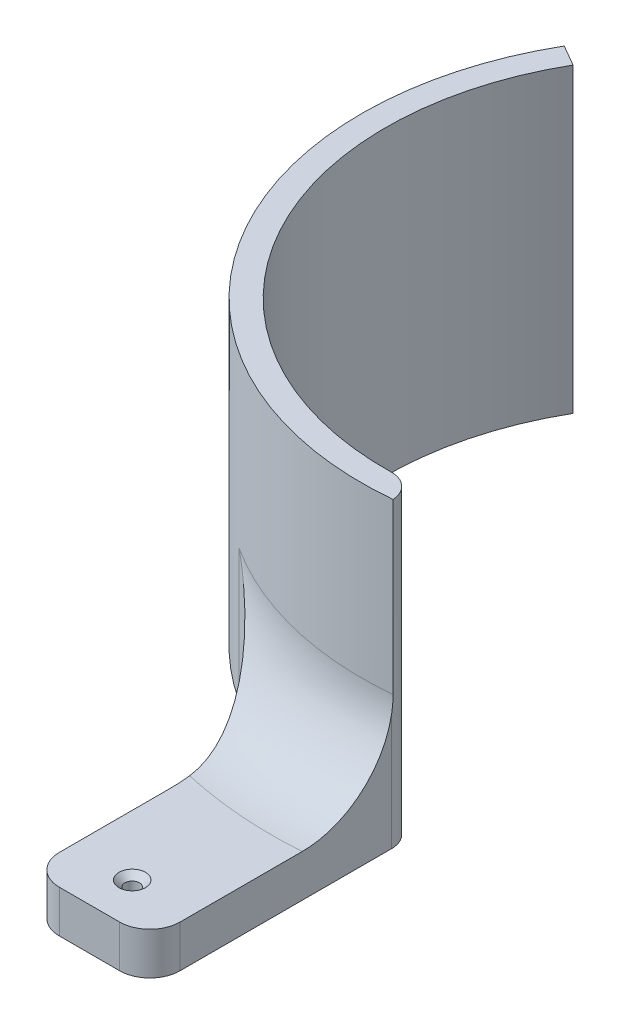
ISO-10303-21;
HEADER;
FILE_DESCRIPTION(('STEP AP214'),'2;1');
FILE_NAME('part.step','',(''),(''),'','','');
FILE_SCHEMA(('AUTOMOTIVE_DESIGN { 1 0 10303 214 1 1 1 1 }'));
ENDSEC;
DATA;
#1=APPLICATION_CONTEXT('core data for automotive mechanical design processes');
#2=APPLICATION_PROTOCOL_DEFINITION('international standard','automotive_design',2000,#1);
#3=PRODUCT_CONTEXT('',#1,'mechanical');
#4=PRODUCT('Part','Part','',(#3));
#5=PRODUCT_RELATED_PRODUCT_CATEGORY('part','',(#4));
#6=PRODUCT_DEFINITION_FORMATION('','',#4);
#7=PRODUCT_DEFINITION_CONTEXT('part definition',#1,'design');
#8=PRODUCT_DEFINITION('design','',#6,#7);
#9=PRODUCT_DEFINITION_SHAPE('','',#8);
#10=(LENGTH_UNIT() NAMED_UNIT(*) SI_UNIT(.MILLI.,.METRE.));
#11=(NAMED_UNIT(*) PLANE_ANGLE_UNIT() SI_UNIT($,.RADIAN.));
#12=(NAMED_UNIT(*) SI_UNIT($,.STERADIAN.) SOLID_ANGLE_UNIT());
#13=UNCERTAINTY_MEASURE_WITH_UNIT(LENGTH_MEASURE(1.E-05),#10,'distance_accuracy_value','');
#14=(GEOMETRIC_REPRESENTATION_CONTEXT(3) GLOBAL_UNCERTAINTY_ASSIGNED_CONTEXT((#13)) GLOBAL_UNIT_ASSIGNED_CONTEXT((#10,
#11,#12)) REPRESENTATION_CONTEXT('',''));
#15=CARTESIAN_POINT('',(0.,0.,0.));
#16=DIRECTION('',(0.,0.,1.));
#17=DIRECTION('',(1.,0.,0.));
#18=AXIS2_PLACEMENT_3D('',#15,#16,#17);
#19=CARTESIAN_POINT('',(-5.,7.,86.));
#20=DIRECTION('',(0.,1.,0.));
#21=DIRECTION('',(0.,0.,1.));
#22=AXIS2_PLACEMENT_3D('',#19,#20,#21);
#23=CYLINDRICAL_SURFACE('',#22,1.19999999999999);
#24=CARTESIAN_POINT('',(-5.,6.,86.));
#25=DIRECTION('',(0.,1.,0.));
#26=DIRECTION('',(0.,0.,1.));
#27=AXIS2_PLACEMENT_3D('',#24,#25,#26);
#28=CIRCLE('',#27,1.2);
#29=CARTESIAN_POINT('',(-5.,6.,87.2));
#30=VERTEX_POINT('',#29);
#31=EDGE_CURVE('E163',#30,#30,#28,.T.);
#32=ORIENTED_EDGE('',*,*,#31,.T.);
#33=EDGE_LOOP('',(#32));
#34=FACE_BOUND('',#33,.T.);
#35=CARTESIAN_POINT('',(-5.,3.,86.));
#36=DIRECTION('',(0.,-1.,0.));
#37=DIRECTION('',(0.,0.,-1.));
#38=AXIS2_PLACEMENT_3D('',#35,#36,#37);
#39=CIRCLE('',#38,1.19999999999999);
#40=CARTESIAN_POINT('',(-5.,3.,84.8));
#41=VERTEX_POINT('',#40);
#42=EDGE_CURVE('E44',#41,#41,#39,.F.);
#43=ORIENTED_EDGE('',*,*,#42,.F.);
#44=EDGE_LOOP('',(#43));
#45=FACE_BOUND('',#44,.T.);
#46=ADVANCED_FACE('F39',(#34,#45),#23,.F.);
#47=CARTESIAN_POINT('',(0.,50.,0.));
#48=DIRECTION('',(0.,-1.,0.));
#49=DIRECTION('',(0.,0.,-1.));
#50=AXIS2_PLACEMENT_3D('',#47,#48,#49);
#51=CYLINDRICAL_SURFACE('',#50,53.);
#52=CARTESIAN_POINT('',(0.,22.,0.));
#53=DIRECTION('',(0.,1.,0.));
#54=DIRECTION('',(0.,0.,1.));
#55=AXIS2_PLACEMENT_3D('',#52,#53,#54);
#56=CIRCLE('',#55,53.);
#57=CARTESIAN_POINT('',(-28.7349397590362,22.,44.5342928207529));
#58=VERTEX_POINT('',#57);
#59=CARTESIAN_POINT('',(4.9935914548164,22.,52.7642307286137));
#60=VERTEX_POINT('',#59);
#61=EDGE_CURVE('E213',#58,#60,#56,.T.);
#62=ORIENTED_EDGE('',*,*,#61,.T.);
#63=DIRECTION('',(0.,-1.,0.));
#64=VECTOR('',#63,1.);
#65=CARTESIAN_POINT('',(4.9935914548164,22.,52.7642307286137));
#66=LINE('',#65,#64);
#67=CARTESIAN_POINT('',(4.99359145481642,50.,52.7642307286137));
#68=VERTEX_POINT('',#67);
#69=EDGE_CURVE('E49',#60,#68,#66,.F.);
#70=ORIENTED_EDGE('',*,*,#69,.T.);
#71=CARTESIAN_POINT('',(0.,50.,0.));
#72=DIRECTION('',(0.,1.,0.));
#73=DIRECTION('',(0.,0.,1.));
#74=AXIS2_PLACEMENT_3D('',#71,#72,#73);
#75=CIRCLE('',#74,53.);
#76=CARTESIAN_POINT('',(-45.8993464005753,50.,-26.4999999999999));
#77=VERTEX_POINT('',#76);
#78=EDGE_CURVE('E188',#77,#68,#75,.T.);
#79=ORIENTED_EDGE('',*,*,#78,.F.);
#80=DIRECTION('',(0.,-1.,0.));
#81=VECTOR('',#80,1.);
#82=CARTESIAN_POINT('',(-45.8993464005753,50.,-26.4999999999999));
#83=LINE('',#82,#81);
#84=CARTESIAN_POINT('',(-45.8993464005753,0.,-26.4999999999999));
#85=VERTEX_POINT('',#84);
#86=EDGE_CURVE('E190',#77,#85,#83,.T.);
#87=ORIENTED_EDGE('',*,*,#86,.T.);
#88=CARTESIAN_POINT('',(0.,0.,0.));
#89=DIRECTION('',(0.,1.,0.));
#90=DIRECTION('',(0.,0.,1.));
#91=AXIS2_PLACEMENT_3D('',#88,#89,#90);
#92=CIRCLE('',#91,53.);
#93=CARTESIAN_POINT('',(-28.7349397590362,0.,44.5342928207529));
#94=VERTEX_POINT('',#93);
#95=EDGE_CURVE('E185',#85,#94,#92,.T.);
#96=ORIENTED_EDGE('',*,*,#95,.T.);
#97=DIRECTION('',(0.,-1.,0.));
#98=VECTOR('',#97,1.);
#99=CARTESIAN_POINT('',(-28.7349397590362,50.,44.5342928207529));
#100=LINE('',#99,#98);
#101=EDGE_CURVE('E207',#94,#58,#100,.F.);
#102=ORIENTED_EDGE('',*,*,#101,.T.);
#103=EDGE_LOOP('',(#62,#70,#79,#87,#96,#102));
#104=FACE_BOUND('',#103,.T.);
#105=ADVANCED_FACE('F263',(#104),#51,.T.);
#106=CARTESIAN_POINT('',(5.00000000000001,50.,52.7636238330917));
#107=DIRECTION('',(-1.,0.,0.));
#108=DIRECTION('',(0.,0.,1.));
#109=AXIS2_PLACEMENT_3D('',#106,#107,#108);
#110=PLANE('',#109);
#111=DIRECTION('',(0.,0.,-1.));
#112=VECTOR('',#111,1.);
#113=CARTESIAN_POINT('',(5.00000000000001,0.,52.7636238330917));
#114=LINE('',#113,#112);
#115=CARTESIAN_POINT('',(5.00000000000001,0.,88.074872));
#116=VERTEX_POINT('',#115);
#117=CARTESIAN_POINT('',(5.00000000000001,0.,52.9905651979671));
#118=VERTEX_POINT('',#117);
#119=EDGE_CURVE('E142',#116,#118,#114,.T.);
#120=ORIENTED_EDGE('',*,*,#119,.T.);
#121=DIRECTION('',(0.,1.,0.));
#122=VECTOR('',#121,1.);
#123=CARTESIAN_POINT('',(5.00000000000001,50.,52.9905651979671));
#124=LINE('',#123,#122);
#125=CARTESIAN_POINT('',(5.00000000000001,19.406361647961,52.9905651979671));
#126=VERTEX_POINT('',#125);
#127=EDGE_CURVE('E248',#118,#126,#124,.T.);
#128=ORIENTED_EDGE('',*,*,#127,.T.);
#129=CARTESIAN_POINT('',(4.99999999999999,22.,52.7636238330917));
#130=CARTESIAN_POINT('',(5.,21.7896684227948,52.7636239609811));
#131=CARTESIAN_POINT('',(5.00000000000001,21.5793625139187,52.7680682974797));
#132=CARTESIAN_POINT('',(5.00000000000001,21.1591266730219,52.7858334416211));
#133=CARTESIAN_POINT('',(5.00000000000001,20.9491967397204,52.7991542189711));
#134=CARTESIAN_POINT('',(5.00000000000001,20.3205732648709,52.852403380692));
#135=CARTESIAN_POINT('',(5.00000000000001,19.9029277045977,52.9056186095851));
#136=CARTESIAN_POINT('',(5.00000000000001,19.0740429292269,53.0470216896745));
#137=CARTESIAN_POINT('',(5.00000000000001,18.6627982923356,53.1351780572822));
#138=CARTESIAN_POINT('',(5.00000000000001,17.8491863055232,53.34581854223));
#139=CARTESIAN_POINT('',(5.00000000000001,17.4468188669925,53.4683023167567));
#140=CARTESIAN_POINT('',(5.00000000000001,16.6536564053013,53.746761055701));
#141=CARTESIAN_POINT('',(5.00000000000001,16.2628663984324,53.9027503027468));
#142=CARTESIAN_POINT('',(5.00000000000001,15.495793755682,54.2470529497319));
#143=CARTESIAN_POINT('',(5.00000000000001,15.1195111644183,54.4353664490754));
#144=CARTESIAN_POINT('',(5.00000000000001,14.3841551097749,54.8429242051387));
#145=CARTESIAN_POINT('',(5.00000000000001,14.0250793303336,55.0621642833407));
#146=CARTESIAN_POINT('',(5.00000000000001,13.3266019633218,55.5300124804355));
#147=CARTESIAN_POINT('',(5.00000000000001,12.9872003109244,55.7786205025516));
#148=CARTESIAN_POINT('',(5.00000000000001,12.3297017616124,56.304013726387));
#149=CARTESIAN_POINT('',(5.00000000000001,12.0116545385873,56.5808610918471));
#150=CARTESIAN_POINT('',(5.00000000000001,11.3999276148495,57.1602839018418));
#151=CARTESIAN_POINT('',(5.00000000000001,11.1062480681791,57.4628595089952));
#152=CARTESIAN_POINT('',(5.00000000000001,10.5452493682504,58.0916451477704));
#153=CARTESIAN_POINT('',(5.00000000000001,10.2779356678764,58.4178600442815));
#154=CARTESIAN_POINT('',(5.00000000000001,9.77160275295379,59.0915471238797));
#155=CARTESIAN_POINT('',(5.00000000000001,9.53258318834467,59.4390190438899));
#156=CARTESIAN_POINT('',(5.00000000000001,9.08357443771194,60.1542367758666));
#157=CARTESIAN_POINT('',(5.00000000000001,8.87370868736317,60.5220600907922));
#158=CARTESIAN_POINT('',(5.00000000000001,8.48564643372473,61.2740491317857));
#159=CARTESIAN_POINT('',(5.00000000000001,8.30745027877539,61.6582150375515));
#160=CARTESIAN_POINT('',(5.00000000000001,7.98404945903902,62.4400079381927));
#161=CARTESIAN_POINT('',(5.00000000000001,7.83883018092782,62.8376288805144));
#162=CARTESIAN_POINT('',(5.00000000000001,7.58233784783105,63.6435074140847));
#163=CARTESIAN_POINT('',(5.00000000000001,7.47105688558824,64.0517625035962));
#164=CARTESIAN_POINT('',(5.00000000000001,7.25187313943226,65.0136926112583));
#165=CARTESIAN_POINT('',(5.00000000000001,7.15743190283525,65.5705267233045));
#166=CARTESIAN_POINT('',(5.00000000000001,7.06299294305981,66.4103367517457));
#167=CARTESIAN_POINT('',(5.00000000000001,7.03938380011824,66.6908760970503));
#168=CARTESIAN_POINT('',(5.00000000000001,7.00788719003877,67.252895439764));
#169=CARTESIAN_POINT('',(5.00000000000001,7.00000304126956,67.5343756231631));
#170=CARTESIAN_POINT('',(5.00000000000001,7.,67.8159273327439));
#171=B_SPLINE_CURVE_WITH_KNOTS('',3,(#129,#130,#131,#132,#133,#134,#135,#136,#137,#138,#139,
#140,#141,#142,#143,#144,#145,#146,#147,#148,#149,#150,#151,#152,#153,#154,#155,#156,#157,#158,
#159,#160,#161,#162,#163,#164,#165,#166,#167,#168,#169,#170),.UNSPECIFIED.,.F.,.F.,(4,2,2,2,2,2,
2,2,2,2,2,2,2,2,2,2,2,2,2,2,4),(0.,0.630896541018762,1.26179092896793,2.52322581844804,
3.78352667103805,5.04381493798084,6.30464150740511,7.56547195422071,8.82613221198046,
10.0867883155825,11.3502819979744,12.6137836670423,13.8775461031959,15.1412929021979,
16.4102370958587,17.6791952460319,18.9475899698433,20.2156889453624,21.9060121719131,
22.7502361460259,23.5946382537582),.UNSPECIFIED.);
#172=CARTESIAN_POINT('',(5.00000000000001,7.,67.8159273327439));
#173=VERTEX_POINT('',#172);
#174=EDGE_CURVE('E217',#126,#173,#171,.T.);
#175=ORIENTED_EDGE('',*,*,#174,.T.);
#176=DIRECTION('',(0.,0.,-1.));
#177=VECTOR('',#176,1.);
#178=CARTESIAN_POINT('',(5.00000000000001,7.,0.));
#179=LINE('',#178,#177);
#180=CARTESIAN_POINT('',(5.00000000000001,7.,88.074872));
#181=VERTEX_POINT('',#180);
#182=EDGE_CURVE('E167',#181,#173,#179,.T.);
#183=ORIENTED_EDGE('',*,*,#182,.F.);
#184=DIRECTION('',(0.,-1.,0.));
#185=VECTOR('',#184,1.);
#186=CARTESIAN_POINT('',(5.00000000000001,7.,88.074872));
#187=LINE('',#186,#185);
#188=EDGE_CURVE('E177',#181,#116,#187,.T.);
#189=ORIENTED_EDGE('',*,*,#188,.T.);
#190=EDGE_LOOP('',(#120,#128,#175,#183,#189));
#191=FACE_BOUND('',#190,.T.);
#192=ADVANCED_FACE('F231',(#191),#110,.F.);
#193=CARTESIAN_POINT('',(0.,50.,0.));
#194=DIRECTION('',(0.,-1.,0.));
#195=DIRECTION('',(0.,0.,-1.));
#196=AXIS2_PLACEMENT_3D('',#193,#194,#195);
#197=CYLINDRICAL_SURFACE('',#196,49.);
#198=CARTESIAN_POINT('',(0.,50.,0.));
#199=DIRECTION('',(0.,1.,0.));
#200=DIRECTION('',(0.,0.,1.));
#201=AXIS2_PLACEMENT_3D('',#198,#199,#200);
#202=CIRCLE('',#201,49.);
#203=CARTESIAN_POINT('',(-42.4352447854376,50.,-24.4999999999999));
#204=VERTEX_POINT('',#203);
#205=CARTESIAN_POINT('',(0.9245283018868,50.,48.9912772584979));
#206=VERTEX_POINT('',#205);
#207=EDGE_CURVE('E181',#204,#206,#202,.T.);
#208=ORIENTED_EDGE('',*,*,#207,.T.);
#209=DIRECTION('',(0.,-1.,0.));
#210=VECTOR('',#209,1.);
#211=CARTESIAN_POINT('',(0.9245283018868,50.,48.9912772584979));
#212=LINE('',#211,#210);
#213=CARTESIAN_POINT('',(0.9245283018868,0.,48.9912772584979));
#214=VERTEX_POINT('',#213);
#215=EDGE_CURVE('E251',#206,#214,#212,.T.);
#216=ORIENTED_EDGE('',*,*,#215,.T.);
#217=CARTESIAN_POINT('',(0.,0.,0.));
#218=DIRECTION('',(0.,1.,0.));
#219=DIRECTION('',(0.,0.,1.));
#220=AXIS2_PLACEMENT_3D('',#217,#218,#219);
#221=CIRCLE('',#220,49.);
#222=CARTESIAN_POINT('',(-42.4352447854376,0.,-24.4999999999999));
#223=VERTEX_POINT('',#222);
#224=EDGE_CURVE('E193',#223,#214,#221,.T.);
#225=ORIENTED_EDGE('',*,*,#224,.F.);
#226=DIRECTION('',(0.,-1.,0.));
#227=VECTOR('',#226,1.);
#228=CARTESIAN_POINT('',(-42.4352447854376,50.,-24.4999999999999));
#229=LINE('',#228,#227);
#230=EDGE_CURVE('E202',#204,#223,#229,.T.);
#231=ORIENTED_EDGE('',*,*,#230,.F.);
#232=EDGE_LOOP('',(#208,#216,#225,#231));
#233=FACE_BOUND('',#232,.T.);
#234=ADVANCED_FACE('F271',(#233),#197,.F.);
#235=CARTESIAN_POINT('',(-45.8993464005753,50.,-26.4999999999999));
#236=DIRECTION('',(0.499999999999997,0.,-0.866025403784441));
#237=DIRECTION('',(-0.866025403784441,0.,-0.499999999999997));
#238=AXIS2_PLACEMENT_3D('',#235,#236,#237);
#239=PLANE('',#238);
#240=DIRECTION('',(0.866025403784441,0.,0.499999999999997));
#241=VECTOR('',#240,1.);
#242=CARTESIAN_POINT('',(-45.8993464005753,0.,-26.4999999999999));
#243=LINE('',#242,#241);
#244=EDGE_CURVE('E196',#85,#223,#243,.T.);
#245=ORIENTED_EDGE('',*,*,#244,.F.);
#246=ORIENTED_EDGE('',*,*,#86,.F.);
#247=DIRECTION('',(0.866025403784441,0.,0.499999999999997));
#248=VECTOR('',#247,1.);
#249=CARTESIAN_POINT('',(-45.8993464005753,50.,-26.4999999999999));
#250=LINE('',#249,#248);
#251=EDGE_CURVE('E184',#77,#204,#250,.T.);
#252=ORIENTED_EDGE('',*,*,#251,.T.);
#253=ORIENTED_EDGE('',*,*,#230,.T.);
#254=EDGE_LOOP('',(#245,#246,#252,#253));
#255=FACE_BOUND('',#254,.T.);
#256=ADVANCED_FACE('F274',(#255),#239,.T.);
#257=CARTESIAN_POINT('',(0.,50.,0.));
#258=DIRECTION('',(0.,1.,0.));
#259=DIRECTION('',(0.,0.,1.));
#260=AXIS2_PLACEMENT_3D('',#257,#258,#259);
#261=PLANE('',#260);
#262=ORIENTED_EDGE('',*,*,#78,.T.);
#263=CARTESIAN_POINT('',(1.00000000000001,50.,52.9905651979671));
#264=DIRECTION('',(0.,1.,0.));
#265=DIRECTION('',(0.,0.,1.));
#266=AXIS2_PLACEMENT_3D('',#263,#264,#265);
#267=CIRCLE('',#266,4.);
#268=EDGE_CURVE('E11',#68,#206,#267,.T.);
#269=ORIENTED_EDGE('',*,*,#268,.T.);
#270=ORIENTED_EDGE('',*,*,#207,.F.);
#271=ORIENTED_EDGE('',*,*,#251,.F.);
#272=EDGE_LOOP('',(#262,#269,#270,#271));
#273=FACE_BOUND('',#272,.T.);
#274=ADVANCED_FACE('F269',(#273),#261,.T.);
#275=CARTESIAN_POINT('',(0.,0.,0.));
#276=DIRECTION('',(0.,1.,0.));
#277=DIRECTION('',(0.,0.,1.));
#278=AXIS2_PLACEMENT_3D('',#275,#276,#277);
#279=PLANE('',#278);
#280=CARTESIAN_POINT('',(-5.,0.,86.));
#281=DIRECTION('',(0.,-1.,0.));
#282=DIRECTION('',(0.,0.,-1.));
#283=AXIS2_PLACEMENT_3D('',#280,#281,#282);
#284=CIRCLE('',#283,2.9);
#285=CARTESIAN_POINT('',(-5.,0.,83.1));
#286=VERTEX_POINT('',#285);
#287=EDGE_CURVE('E483',#286,#286,#284,.T.);
#288=ORIENTED_EDGE('',*,*,#287,.F.);
#289=EDGE_LOOP('',(#288));
#290=FACE_BOUND('',#289,.T.);
#291=ORIENTED_EDGE('',*,*,#224,.T.);
#292=CARTESIAN_POINT('',(1.00000000000001,0.,52.9905651979671));
#293=DIRECTION('',(0.,1.,0.));
#294=DIRECTION('',(0.,0.,1.));
#295=AXIS2_PLACEMENT_3D('',#292,#293,#294);
#296=CIRCLE('',#295,4.);
#297=EDGE_CURVE('E250',#214,#118,#296,.F.);
#298=ORIENTED_EDGE('',*,*,#297,.T.);
#299=ORIENTED_EDGE('',*,*,#119,.F.);
#300=CARTESIAN_POINT('',(0.,0.,88.074872));
#301=DIRECTION('',(0.,1.,0.));
#302=DIRECTION('',(0.,0.,1.));
#303=AXIS2_PLACEMENT_3D('',#300,#301,#302);
#304=CIRCLE('',#303,5.);
#305=CARTESIAN_POINT('',(0.,0.,93.074872));
#306=VERTEX_POINT('',#305);
#307=EDGE_CURVE('E160',#116,#306,#304,.F.);
#308=ORIENTED_EDGE('',*,*,#307,.T.);
#309=DIRECTION('',(1.,0.,0.));
#310=VECTOR('',#309,1.);
#311=CARTESIAN_POINT('',(1.29167332385549E-13,0.,93.074872));
#312=LINE('',#311,#310);
#313=CARTESIAN_POINT('',(-9.99999999999999,0.,93.074872));
#314=VERTEX_POINT('',#313);
#315=EDGE_CURVE('E172',#314,#306,#312,.T.);
#316=ORIENTED_EDGE('',*,*,#315,.F.);
#317=CARTESIAN_POINT('',(-9.99999999999999,0.,88.074872));
#318=DIRECTION('',(0.,1.,0.));
#319=DIRECTION('',(0.,0.,1.));
#320=AXIS2_PLACEMENT_3D('',#317,#318,#319);
#321=CIRCLE('',#320,5.00000000000001);
#322=CARTESIAN_POINT('',(-15.,0.,88.074872));
#323=VERTEX_POINT('',#322);
#324=EDGE_CURVE('E138',#314,#323,#321,.F.);
#325=ORIENTED_EDGE('',*,*,#324,.T.);
#326=DIRECTION('',(0.,0.,1.));
#327=VECTOR('',#326,1.);
#328=CARTESIAN_POINT('',(-15.,0.,0.));
#329=LINE('',#328,#327);
#330=CARTESIAN_POINT('',(-15.,0.,69.7423830966508));
#331=VERTEX_POINT('',#330);
#332=EDGE_CURVE('E158',#331,#323,#329,.T.);
#333=ORIENTED_EDGE('',*,*,#332,.F.);
#334=CARTESIAN_POINT('',(-45.,0.,69.7423830966508));
#335=DIRECTION('',(0.,1.,0.));
#336=DIRECTION('',(0.,0.,1.));
#337=AXIS2_PLACEMENT_3D('',#334,#335,#336);
#338=CIRCLE('',#337,30.);
#339=EDGE_CURVE('E209',#331,#94,#338,.T.);
#340=ORIENTED_EDGE('',*,*,#339,.T.);
#341=ORIENTED_EDGE('',*,*,#95,.F.);
#342=ORIENTED_EDGE('',*,*,#244,.T.);
#343=EDGE_LOOP('',(#291,#298,#299,#308,#316,#325,#333,#340,#341,#342));
#344=FACE_BOUND('',#343,.T.);
#345=ADVANCED_FACE('F277',(#290,#344),#279,.F.);
#346=CARTESIAN_POINT('',(-9.99999999999999,7.,88.074872));
#347=DIRECTION('',(0.,-1.,0.));
#348=DIRECTION('',(0.,0.,-1.));
#349=AXIS2_PLACEMENT_3D('',#346,#347,#348);
#350=CYLINDRICAL_SURFACE('',#349,5.00000000000001);
#351=ORIENTED_EDGE('',*,*,#324,.F.);
#352=DIRECTION('',(0.,-1.,0.));
#353=VECTOR('',#352,1.);
#354=CARTESIAN_POINT('',(-9.99999999999999,7.,93.074872));
#355=LINE('',#354,#353);
#356=CARTESIAN_POINT('',(-9.99999999999999,7.,93.074872));
#357=VERTEX_POINT('',#356);
#358=EDGE_CURVE('E131',#357,#314,#355,.T.);
#359=ORIENTED_EDGE('',*,*,#358,.F.);
#360=CARTESIAN_POINT('',(-9.99999999999999,7.,88.074872));
#361=DIRECTION('',(0.,1.,0.));
#362=DIRECTION('',(0.,0.,1.));
#363=AXIS2_PLACEMENT_3D('',#360,#361,#362);
#364=CIRCLE('',#363,5.00000000000001);
#365=CARTESIAN_POINT('',(-15.,7.,88.074872));
#366=VERTEX_POINT('',#365);
#367=EDGE_CURVE('E136',#357,#366,#364,.F.);
#368=ORIENTED_EDGE('',*,*,#367,.T.);
#369=DIRECTION('',(0.,-1.,0.));
#370=VECTOR('',#369,1.);
#371=CARTESIAN_POINT('',(-15.,7.,88.074872));
#372=LINE('',#371,#370);
#373=EDGE_CURVE('E170',#366,#323,#372,.T.);
#374=ORIENTED_EDGE('',*,*,#373,.T.);
#375=EDGE_LOOP('',(#351,#359,#368,#374));
#376=FACE_BOUND('',#375,.T.);
#377=ADVANCED_FACE('F133',(#376),#350,.T.);
#378=CARTESIAN_POINT('',(1.29167332385549E-13,7.,93.074872));
#379=DIRECTION('',(0.,0.,-1.));
#380=DIRECTION('',(-1.,0.,0.));
#381=AXIS2_PLACEMENT_3D('',#378,#379,#380);
#382=PLANE('',#381);
#383=ORIENTED_EDGE('',*,*,#315,.T.);
#384=DIRECTION('',(0.,-1.,0.));
#385=VECTOR('',#384,1.);
#386=CARTESIAN_POINT('',(0.,7.,93.074872));
#387=LINE('',#386,#385);
#388=CARTESIAN_POINT('',(0.,7.,93.074872));
#389=VERTEX_POINT('',#388);
#390=EDGE_CURVE('E143',#389,#306,#387,.T.);
#391=ORIENTED_EDGE('',*,*,#390,.F.);
#392=DIRECTION('',(1.,0.,0.));
#393=VECTOR('',#392,1.);
#394=CARTESIAN_POINT('',(1.29167332385549E-13,7.,93.074872));
#395=LINE('',#394,#393);
#396=EDGE_CURVE('E146',#357,#389,#395,.T.);
#397=ORIENTED_EDGE('',*,*,#396,.F.);
#398=ORIENTED_EDGE('',*,*,#358,.T.);
#399=EDGE_LOOP('',(#383,#391,#397,#398));
#400=FACE_BOUND('',#399,.T.);
#401=ADVANCED_FACE('F147',(#400),#382,.F.);
#402=CARTESIAN_POINT('',(0.,7.,88.074872));
#403=DIRECTION('',(0.,-1.,0.));
#404=DIRECTION('',(0.,0.,-1.));
#405=AXIS2_PLACEMENT_3D('',#402,#403,#404);
#406=CYLINDRICAL_SURFACE('',#405,5.);
#407=ORIENTED_EDGE('',*,*,#307,.F.);
#408=ORIENTED_EDGE('',*,*,#188,.F.);
#409=CARTESIAN_POINT('',(0.,7.,88.074872));
#410=DIRECTION('',(0.,1.,0.));
#411=DIRECTION('',(0.,0.,1.));
#412=AXIS2_PLACEMENT_3D('',#409,#410,#411);
#413=CIRCLE('',#412,5.);
#414=EDGE_CURVE('E151',#181,#389,#413,.F.);
#415=ORIENTED_EDGE('',*,*,#414,.T.);
#416=ORIENTED_EDGE('',*,*,#390,.T.);
#417=EDGE_LOOP('',(#407,#408,#415,#416));
#418=FACE_BOUND('',#417,.T.);
#419=ADVANCED_FACE('F283',(#418),#406,.T.);
#420=CARTESIAN_POINT('',(-15.,7.,0.));
#421=DIRECTION('',(1.,0.,0.));
#422=DIRECTION('',(0.,0.,-1.));
#423=AXIS2_PLACEMENT_3D('',#420,#421,#422);
#424=PLANE('',#423);
#425=DIRECTION('',(0.,0.,1.));
#426=VECTOR('',#425,1.);
#427=CARTESIAN_POINT('',(-15.,7.,0.));
#428=LINE('',#427,#426);
#429=CARTESIAN_POINT('',(-15.,7.,69.7423830966508));
#430=VERTEX_POINT('',#429);
#431=EDGE_CURVE('E156',#430,#366,#428,.T.);
#432=ORIENTED_EDGE('',*,*,#431,.F.);
#433=DIRECTION('',(0.,1.,0.));
#434=VECTOR('',#433,1.);
#435=CARTESIAN_POINT('',(-15.,0.,69.7423830966508));
#436=LINE('',#435,#434);
#437=EDGE_CURVE('E204',#430,#331,#436,.F.);
#438=ORIENTED_EDGE('',*,*,#437,.T.);
#439=ORIENTED_EDGE('',*,*,#332,.T.);
#440=ORIENTED_EDGE('',*,*,#373,.F.);
#441=EDGE_LOOP('',(#432,#438,#439,#440));
#442=FACE_BOUND('',#441,.T.);
#443=ADVANCED_FACE('F280',(#442),#424,.F.);
#444=CARTESIAN_POINT('',(0.,7.,0.));
#445=DIRECTION('',(0.,1.,0.));
#446=DIRECTION('',(0.,0.,1.));
#447=AXIS2_PLACEMENT_3D('',#444,#445,#446);
#448=PLANE('',#447);
#449=CARTESIAN_POINT('',(-5.,7.,86.));
#450=DIRECTION('',(0.,1.,0.));
#451=DIRECTION('',(0.,0.,1.));
#452=AXIS2_PLACEMENT_3D('',#449,#450,#451);
#453=CIRCLE('',#452,2.2);
#454=CARTESIAN_POINT('',(-5.,7.,88.2));
#455=VERTEX_POINT('',#454);
#456=EDGE_CURVE('E486',#455,#455,#453,.T.);
#457=ORIENTED_EDGE('',*,*,#456,.F.);
#458=EDGE_LOOP('',(#457));
#459=FACE_BOUND('',#458,.T.);
#460=ORIENTED_EDGE('',*,*,#182,.T.);
#461=CARTESIAN_POINT('',(0.,7.,0.));
#462=DIRECTION('',(0.,1.,0.));
#463=DIRECTION('',(0.,0.,1.));
#464=AXIS2_PLACEMENT_3D('',#461,#462,#463);
#465=CIRCLE('',#464,68.);
#466=CARTESIAN_POINT('',(-15.2005549390456,7.,66.2792812992496));
#467=VERTEX_POINT('',#466);
#468=EDGE_CURVE('E215',#173,#467,#465,.F.);
#469=ORIENTED_EDGE('',*,*,#468,.T.);
#470=CARTESIAN_POINT('',(-45.,7.,69.7423830966508));
#471=DIRECTION('',(0.,1.,0.));
#472=DIRECTION('',(0.,0.,1.));
#473=AXIS2_PLACEMENT_3D('',#470,#471,#472);
#474=CIRCLE('',#473,30.);
#475=EDGE_CURVE('E211',#467,#430,#474,.F.);
#476=ORIENTED_EDGE('',*,*,#475,.T.);
#477=ORIENTED_EDGE('',*,*,#431,.T.);
#478=ORIENTED_EDGE('',*,*,#367,.F.);
#479=ORIENTED_EDGE('',*,*,#396,.T.);
#480=ORIENTED_EDGE('',*,*,#414,.F.);
#481=EDGE_LOOP('',(#460,#469,#476,#477,#478,#479,#480));
#482=FACE_BOUND('',#481,.T.);
#483=ADVANCED_FACE('F154',(#459,#482),#448,.T.);
#484=CARTESIAN_POINT('',(-5.,7.,86.));
#485=DIRECTION('',(0.,1.,0.));
#486=DIRECTION('',(0.,0.,1.));
#487=AXIS2_PLACEMENT_3D('',#484,#485,#486);
#488=CONICAL_SURFACE('',#487,2.2,0.785398163397447);
#489=ORIENTED_EDGE('',*,*,#31,.F.);
#490=EDGE_LOOP('',(#489));
#491=FACE_BOUND('',#490,.T.);
#492=ORIENTED_EDGE('',*,*,#456,.T.);
#493=EDGE_LOOP('',(#492));
#494=FACE_BOUND('',#493,.T.);
#495=ADVANCED_FACE('F301',(#491,#494),#488,.F.);
#496=CARTESIAN_POINT('',(-45.,50.,69.7423830966508));
#497=DIRECTION('',(0.,-1.,0.));
#498=DIRECTION('',(0.,0.,-1.));
#499=AXIS2_PLACEMENT_3D('',#496,#497,#498);
#500=CYLINDRICAL_SURFACE('',#499,30.);
#501=ORIENTED_EDGE('',*,*,#475,.F.);
#502=CARTESIAN_POINT('',(-15.2005549390456,7.,66.2792812992496));
#503=CARTESIAN_POINT('',(-15.228874324213,6.99999719180966,66.0355589922079));
#504=CARTESIAN_POINT('',(-15.2601876833398,7.00534729142292,65.7922345394015));
#505=CARTESIAN_POINT('',(-15.3286912432095,7.02638897025402,65.3069074783837));
#506=CARTESIAN_POINT('',(-15.3658803398487,7.04207860833286,65.064904630652));
#507=CARTESIAN_POINT('',(-15.4859601503491,7.1040351434864,64.3424456726552));
#508=CARTESIAN_POINT('',(-15.5774717140586,7.16519248006674,63.8646104416436));
#509=CARTESIAN_POINT('',(-15.7808258388374,7.32288417358475,62.925638680813));
#510=CARTESIAN_POINT('',(-15.8924076342862,7.41897928772144,62.4643697480916));
#511=CARTESIAN_POINT('',(-16.1350679244408,7.6431902568774,61.5547438556194));
#512=CARTESIAN_POINT('',(-16.2661565679618,7.77132280373832,61.1063937629493));
#513=CARTESIAN_POINT('',(-16.5881692222972,8.0989282863964,60.0920054500362));
#514=CARTESIAN_POINT('',(-16.7852350982608,8.30826821120461,59.531098686016));
#515=CARTESIAN_POINT('',(-17.2056555623651,8.76789872597282,58.4367051023151));
#516=CARTESIAN_POINT('',(-17.4290158234323,9.01819815737121,57.9032242354803));
#517=CARTESIAN_POINT('',(-17.8999110507815,9.55464488193558,56.861635539232));
#518=CARTESIAN_POINT('',(-18.1475716834572,9.84098094725603,56.3536826261569));
#519=CARTESIAN_POINT('',(-18.6631863214972,10.4427279266203,55.365915891009));
#520=CARTESIAN_POINT('',(-18.9311478861748,10.7581496806824,54.8861126700111));
#521=CARTESIAN_POINT('',(-19.4290391913452,11.3469932998978,54.0480125965207));
#522=CARTESIAN_POINT('',(-19.6557517260106,11.6160703656552,53.6847140981393));
#523=CARTESIAN_POINT('',(-20.1194721775909,12.1673058134521,52.9751855139376));
#524=CARTESIAN_POINT('',(-20.3564778522704,12.4494613473983,52.6289517455088));
#525=CARTESIAN_POINT('',(-20.8401661931038,13.0251746499251,51.9526276623613));
#526=CARTESIAN_POINT('',(-21.0868554869344,13.3187402263784,51.6225487641921));
#527=CARTESIAN_POINT('',(-21.5891114802518,13.9154089832891,50.9781301080178));
#528=CARTESIAN_POINT('',(-21.844678631312,14.2185126488286,50.6637911526182));
#529=CARTESIAN_POINT('',(-22.3640499232481,14.8326010349187,50.0503745882552));
#530=CARTESIAN_POINT('',(-22.627850356325,15.1435821963416,49.7512902648783));
#531=CARTESIAN_POINT('',(-23.1634131507371,15.7722113144482,49.167632935849));
#532=CARTESIAN_POINT('',(-23.4351754855234,16.0898592489006,48.8830598818176));
#533=CARTESIAN_POINT('',(-23.9862750153526,16.730472559764,48.3279896235467));
#534=CARTESIAN_POINT('',(-24.2656088705019,17.0534355677031,48.0574863618358));
#535=CARTESIAN_POINT('',(-24.8317998578299,17.703712725064,47.5299219694826));
#536=CARTESIAN_POINT('',(-25.1186570711481,18.0310269213944,47.2728609839045));
#537=CARTESIAN_POINT('',(-25.6727973226211,18.6583959139379,46.7950446261703));
#538=CARTESIAN_POINT('',(-25.9394205723041,18.9581557311375,46.573135865945));
#539=CARTESIAN_POINT('',(-26.4787540297059,19.5596571321412,46.1397755452298));
#540=CARTESIAN_POINT('',(-26.7514637107361,19.8613985428857,45.9283230849583));
#541=CARTESIAN_POINT('',(-27.5782441417028,20.7679749674184,45.3096958801199));
#542=CARTESIAN_POINT('',(-28.1415978707484,21.3748807121405,44.9177077885778));
#543=CARTESIAN_POINT('',(-28.7233282159205,21.9877705803876,44.541787803447));
#544=CARTESIAN_POINT('',(-28.7291333489732,21.9938852983064,44.5380393059935));
#545=CARTESIAN_POINT('',(-28.7349397590361,22.,44.5342928207529));
#546=B_SPLINE_CURVE_WITH_KNOTS('',3,(#502,#503,#504,#505,#506,#507,#508,#509,#510,#511,#512,
#513,#514,#515,#516,#517,#518,#519,#520,#521,#522,#523,#524,#525,#526,#527,#528,#529,#530,#531,
#532,#533,#534,#535,#536,#537,#538,#539,#540,#541,#542,#543,#544,#545),.UNSPECIFIED.,.F.,.F.,(4,
2,2,2,2,2,2,2,2,2,2,2,2,2,2,2,2,2,2,2,2,4),(0.,0.73591920903242,1.4717002963614,
2.94046921633255,4.39137730193934,5.84304290698759,7.73103551852347,9.61943620730978,
11.5181763457927,13.417627012851,14.9343173026406,16.450678841012,17.9680969512844,
19.485592358568,21.0024139631258,22.5192305104342,24.0353885231449,25.5515628943088,
26.9267708151795,28.3018601904902,31.0487417508305,31.0764232448571),.UNSPECIFIED.);
#547=EDGE_CURVE('E224',#467,#58,#546,.T.);
#548=ORIENTED_EDGE('',*,*,#547,.T.);
#549=ORIENTED_EDGE('',*,*,#101,.F.);
#550=ORIENTED_EDGE('',*,*,#339,.F.);
#551=ORIENTED_EDGE('',*,*,#437,.F.);
#552=EDGE_LOOP('',(#501,#548,#549,#550,#551));
#553=FACE_BOUND('',#552,.T.);
#554=ADVANCED_FACE('F237',(#553),#500,.F.);
#555=CARTESIAN_POINT('',(0.,22.,0.));
#556=DIRECTION('',(0.,1.,0.));
#557=DIRECTION('',(0.,0.,1.));
#558=AXIS2_PLACEMENT_3D('',#555,#556,#557);
#559=TOROIDAL_SURFACE('',#558,68.,15.);
#560=ORIENTED_EDGE('',*,*,#174,.F.);
#561=CARTESIAN_POINT('',(5.00000000000001,19.406361647961,52.9905651979671));
#562=CARTESIAN_POINT('',(4.99996670667464,19.6205011479974,52.9528049795369));
#563=CARTESIAN_POINT('',(4.99946542212631,19.8354696050596,52.9197698191345));
#564=CARTESIAN_POINT('',(4.99808003492555,20.2662373395321,52.863203029659));
#565=CARTESIAN_POINT('',(4.99719666096566,20.4820342643667,52.8396534746267));
#566=CARTESIAN_POINT('',(4.99559594810345,20.9144476754089,52.8019679988777));
#567=CARTESIAN_POINT('',(4.99487860878397,21.1310641595561,52.7878320545095));
#568=CARTESIAN_POINT('',(4.99385921987151,21.5651199043709,52.7689545517302));
#569=CARTESIAN_POINT('',(4.99355796262009,21.7825599463271,52.7642309095385));
#570=CARTESIAN_POINT('',(4.99359145481642,22.,52.7642307286137));
#571=B_SPLINE_CURVE_WITH_KNOTS('',3,(#561,#562,#563,#564,#565,#566,#567,#568,#569,#570),
.UNSPECIFIED.,.F.,.F.,(4,2,2,2,4),(0.,0.652270662157446,1.30330280945849,1.95433332105162,
2.60660188312973),.UNSPECIFIED.);
#572=EDGE_CURVE('E63',#126,#60,#571,.T.);
#573=ORIENTED_EDGE('',*,*,#572,.T.);
#574=ORIENTED_EDGE('',*,*,#61,.F.);
#575=ORIENTED_EDGE('',*,*,#547,.F.);
#576=ORIENTED_EDGE('',*,*,#468,.F.);
#577=EDGE_LOOP('',(#560,#573,#574,#575,#576));
#578=FACE_BOUND('',#577,.T.);
#579=ADVANCED_FACE('F234',(#578),#559,.F.);
#580=CARTESIAN_POINT('',(1.00000000000001,50.,52.9905651979671));
#581=DIRECTION('',(0.,-1.,0.));
#582=DIRECTION('',(0.,0.,-1.));
#583=AXIS2_PLACEMENT_3D('',#580,#581,#582);
#584=CYLINDRICAL_SURFACE('',#583,4.);
#585=ORIENTED_EDGE('',*,*,#572,.F.);
#586=ORIENTED_EDGE('',*,*,#127,.F.);
#587=ORIENTED_EDGE('',*,*,#297,.F.);
#588=ORIENTED_EDGE('',*,*,#215,.F.);
#589=ORIENTED_EDGE('',*,*,#268,.F.);
#590=ORIENTED_EDGE('',*,*,#69,.F.);
#591=EDGE_LOOP('',(#585,#586,#587,#588,#589,#590));
#592=FACE_BOUND('',#591,.T.);
#593=ADVANCED_FACE('F41',(#592),#584,.T.);
#594=CARTESIAN_POINT('',(-5.,3.,86.));
#595=DIRECTION('',(0.,-1.,0.));
#596=DIRECTION('',(0.,0.,-1.));
#597=AXIS2_PLACEMENT_3D('',#594,#595,#596);
#598=PLANE('',#597);
#599=CARTESIAN_POINT('',(-5.,3.,86.));
#600=DIRECTION('',(0.,-1.,0.));
#601=DIRECTION('',(0.,0.,-1.));
#602=AXIS2_PLACEMENT_3D('',#599,#600,#601);
#603=CIRCLE('',#602,2.9);
#604=CARTESIAN_POINT('',(-5.,3.,83.1));
#605=VERTEX_POINT('',#604);
#606=EDGE_CURVE('E480',#605,#605,#603,.T.);
#607=ORIENTED_EDGE('',*,*,#606,.T.);
#608=EDGE_LOOP('',(#607));
#609=FACE_BOUND('',#608,.T.);
#610=ORIENTED_EDGE('',*,*,#42,.T.);
#611=EDGE_LOOP('',(#610));
#612=FACE_BOUND('',#611,.T.);
#613=ADVANCED_FACE('F375',(#609,#612),#598,.T.);
#614=CARTESIAN_POINT('',(-5.,3.,86.));
#615=DIRECTION('',(0.,-1.,0.));
#616=DIRECTION('',(0.,0.,-1.));
#617=AXIS2_PLACEMENT_3D('',#614,#615,#616);
#618=CYLINDRICAL_SURFACE('',#617,2.9);
#619=ORIENTED_EDGE('',*,*,#606,.F.);
#620=EDGE_LOOP('',(#619));
#621=FACE_BOUND('',#620,.T.);
#622=ORIENTED_EDGE('',*,*,#287,.T.);
#623=EDGE_LOOP('',(#622));
#624=FACE_BOUND('',#623,.T.);
#625=ADVANCED_FACE('F380',(#621,#624),#618,.F.);
#626=CLOSED_SHELL('',(#46,#105,#192,#234,#256,#274,#345,#377,#401,#419,#443,#483,#495,#554,#579,
#593,#613,#625));
#627=MANIFOLD_SOLID_BREP('B2',#626);
#628=ADVANCED_BREP_SHAPE_REPRESENTATION('',(#18,#627),#14);
#629=SHAPE_DEFINITION_REPRESENTATION(#9,#628);
ENDSEC;
END-ISO-10303-21;
